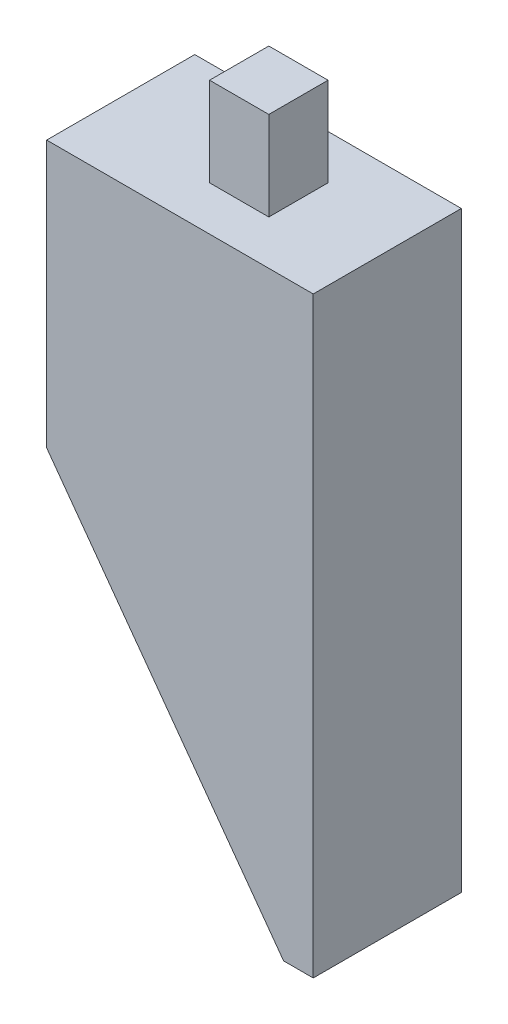
ISO-10303-21;
HEADER;
FILE_DESCRIPTION(('STEP AP214'),'2;1');
FILE_NAME('part.step','',(''),(''),'','','');
FILE_SCHEMA(('AUTOMOTIVE_DESIGN { 1 0 10303 214 1 1 1 1 }'));
ENDSEC;
DATA;
#1=APPLICATION_CONTEXT('core data for automotive mechanical design processes');
#2=APPLICATION_PROTOCOL_DEFINITION('international standard','automotive_design',2000,#1);
#3=PRODUCT_CONTEXT('',#1,'mechanical');
#4=PRODUCT('Part','Part','',(#3));
#5=PRODUCT_RELATED_PRODUCT_CATEGORY('part','',(#4));
#6=PRODUCT_DEFINITION_FORMATION('','',#4);
#7=PRODUCT_DEFINITION_CONTEXT('part definition',#1,'design');
#8=PRODUCT_DEFINITION('design','',#6,#7);
#9=PRODUCT_DEFINITION_SHAPE('','',#8);
#10=(LENGTH_UNIT() NAMED_UNIT(*) SI_UNIT(.MILLI.,.METRE.));
#11=(NAMED_UNIT(*) PLANE_ANGLE_UNIT() SI_UNIT($,.RADIAN.));
#12=(NAMED_UNIT(*) SI_UNIT($,.STERADIAN.) SOLID_ANGLE_UNIT());
#13=UNCERTAINTY_MEASURE_WITH_UNIT(LENGTH_MEASURE(1.E-05),#10,'distance_accuracy_value','');
#14=(GEOMETRIC_REPRESENTATION_CONTEXT(3) GLOBAL_UNCERTAINTY_ASSIGNED_CONTEXT((#13)) GLOBAL_UNIT_ASSIGNED_CONTEXT((#10,
#11,#12)) REPRESENTATION_CONTEXT('',''));
#15=CARTESIAN_POINT('',(0.,0.,0.));
#16=DIRECTION('',(0.,0.,1.));
#17=DIRECTION('',(1.,0.,0.));
#18=AXIS2_PLACEMENT_3D('',#15,#16,#17);
#19=CARTESIAN_POINT('',(90.,200.,50.));
#20=DIRECTION('',(0.,-1.,0.));
#21=DIRECTION('',(0.,0.,-1.));
#22=AXIS2_PLACEMENT_3D('',#19,#20,#21);
#23=PLANE('',#22);
#24=DIRECTION('',(-1.,0.,0.));
#25=VECTOR('',#24,1.);
#26=CARTESIAN_POINT('',(90.,200.,0.));
#27=LINE('',#26,#25);
#28=CARTESIAN_POINT('',(90.,200.,0.));
#29=VERTEX_POINT('',#28);
#30=CARTESIAN_POINT('',(0.,200.,0.));
#31=VERTEX_POINT('',#30);
#32=EDGE_CURVE('E125',#29,#31,#27,.T.);
#33=ORIENTED_EDGE('',*,*,#32,.T.);
#34=DIRECTION('',(0.,0.,-1.));
#35=VECTOR('',#34,1.);
#36=CARTESIAN_POINT('',(0.,200.,50.));
#37=LINE('',#36,#35);
#38=CARTESIAN_POINT('',(0.,200.,50.));
#39=VERTEX_POINT('',#38);
#40=EDGE_CURVE('E11',#39,#31,#37,.T.);
#41=ORIENTED_EDGE('',*,*,#40,.F.);
#42=DIRECTION('',(-1.,0.,0.));
#43=VECTOR('',#42,1.);
#44=CARTESIAN_POINT('',(90.,200.,50.));
#45=LINE('',#44,#43);
#46=CARTESIAN_POINT('',(90.,200.,50.));
#47=VERTEX_POINT('',#46);
#48=EDGE_CURVE('E134',#47,#39,#45,.T.);
#49=ORIENTED_EDGE('',*,*,#48,.F.);
#50=DIRECTION('',(0.,0.,-1.));
#51=VECTOR('',#50,1.);
#52=CARTESIAN_POINT('',(90.,200.,50.));
#53=LINE('',#52,#51);
#54=EDGE_CURVE('E145',#47,#29,#53,.T.);
#55=ORIENTED_EDGE('',*,*,#54,.T.);
#56=EDGE_LOOP('',(#33,#41,#49,#55));
#57=FACE_BOUND('',#56,.T.);
#58=DIRECTION('',(0.,0.,1.));
#59=VECTOR('',#58,1.);
#60=CARTESIAN_POINT('',(40.,200.,15.));
#61=LINE('',#60,#59);
#62=CARTESIAN_POINT('',(40.,200.,15.));
#63=VERTEX_POINT('',#62);
#64=CARTESIAN_POINT('',(40.,200.,35.));
#65=VERTEX_POINT('',#64);
#66=EDGE_CURVE('E124',#63,#65,#61,.T.);
#67=ORIENTED_EDGE('',*,*,#66,.F.);
#68=DIRECTION('',(-1.,0.,0.));
#69=VECTOR('',#68,1.);
#70=CARTESIAN_POINT('',(40.,200.,15.));
#71=LINE('',#70,#69);
#72=CARTESIAN_POINT('',(60.,200.,15.));
#73=VERTEX_POINT('',#72);
#74=EDGE_CURVE('E121',#73,#63,#71,.T.);
#75=ORIENTED_EDGE('',*,*,#74,.F.);
#76=DIRECTION('',(0.,0.,-1.));
#77=VECTOR('',#76,1.);
#78=CARTESIAN_POINT('',(60.,200.,15.));
#79=LINE('',#78,#77);
#80=CARTESIAN_POINT('',(60.,200.,35.));
#81=VERTEX_POINT('',#80);
#82=EDGE_CURVE('E53',#81,#73,#79,.T.);
#83=ORIENTED_EDGE('',*,*,#82,.F.);
#84=DIRECTION('',(1.,0.,0.));
#85=VECTOR('',#84,1.);
#86=CARTESIAN_POINT('',(40.,200.,35.));
#87=LINE('',#86,#85);
#88=EDGE_CURVE('E48',#65,#81,#87,.T.);
#89=ORIENTED_EDGE('',*,*,#88,.F.);
#90=EDGE_LOOP('',(#67,#75,#83,#89));
#91=FACE_BOUND('',#90,.T.);
#92=ADVANCED_FACE('F34',(#57,#91),#23,.F.);
#93=CARTESIAN_POINT('',(0.,200.,50.));
#94=DIRECTION('',(1.,0.,0.));
#95=DIRECTION('',(0.,1.,0.));
#96=AXIS2_PLACEMENT_3D('',#93,#94,#95);
#97=PLANE('',#96);
#98=DIRECTION('',(0.,-1.,0.));
#99=VECTOR('',#98,1.);
#100=CARTESIAN_POINT('',(0.,200.,0.));
#101=LINE('',#100,#99);
#102=CARTESIAN_POINT('',(0.,110.,0.));
#103=VERTEX_POINT('',#102);
#104=EDGE_CURVE('E128',#31,#103,#101,.T.);
#105=ORIENTED_EDGE('',*,*,#104,.T.);
#106=DIRECTION('',(0.,0.,-1.));
#107=VECTOR('',#106,1.);
#108=CARTESIAN_POINT('',(0.,110.,50.));
#109=LINE('',#108,#107);
#110=CARTESIAN_POINT('',(0.,110.,50.));
#111=VERTEX_POINT('',#110);
#112=EDGE_CURVE('E41',#111,#103,#109,.T.);
#113=ORIENTED_EDGE('',*,*,#112,.F.);
#114=DIRECTION('',(0.,-1.,0.));
#115=VECTOR('',#114,1.);
#116=CARTESIAN_POINT('',(0.,200.,50.));
#117=LINE('',#116,#115);
#118=EDGE_CURVE('E137',#39,#111,#117,.T.);
#119=ORIENTED_EDGE('',*,*,#118,.F.);
#120=ORIENTED_EDGE('',*,*,#40,.T.);
#121=EDGE_LOOP('',(#105,#113,#119,#120));
#122=FACE_BOUND('',#121,.T.);
#123=ADVANCED_FACE('F185',(#122),#97,.F.);
#124=CARTESIAN_POINT('',(0.,110.,50.));
#125=DIRECTION('',(0.808736084303189,0.588171697675046,0.));
#126=DIRECTION('',(-0.588171697675046,0.808736084303188,0.));
#127=AXIS2_PLACEMENT_3D('',#124,#125,#126);
#128=PLANE('',#127);
#129=DIRECTION('',(0.588171697675046,-0.808736084303189,0.));
#130=VECTOR('',#129,1.);
#131=CARTESIAN_POINT('',(0.,110.,0.));
#132=LINE('',#131,#130);
#133=CARTESIAN_POINT('',(80.,0.,0.));
#134=VERTEX_POINT('',#133);
#135=EDGE_CURVE('E148',#103,#134,#132,.T.);
#136=ORIENTED_EDGE('',*,*,#135,.T.);
#137=DIRECTION('',(0.,0.,-1.));
#138=VECTOR('',#137,1.);
#139=CARTESIAN_POINT('',(80.,0.,50.));
#140=LINE('',#139,#138);
#141=CARTESIAN_POINT('',(80.,0.,50.));
#142=VERTEX_POINT('',#141);
#143=EDGE_CURVE('E158',#142,#134,#140,.T.);
#144=ORIENTED_EDGE('',*,*,#143,.F.);
#145=DIRECTION('',(0.588171697675046,-0.808736084303189,0.));
#146=VECTOR('',#145,1.);
#147=CARTESIAN_POINT('',(0.,110.,50.));
#148=LINE('',#147,#146);
#149=EDGE_CURVE('E140',#111,#142,#148,.T.);
#150=ORIENTED_EDGE('',*,*,#149,.F.);
#151=ORIENTED_EDGE('',*,*,#112,.T.);
#152=EDGE_LOOP('',(#136,#144,#150,#151));
#153=FACE_BOUND('',#152,.T.);
#154=ADVANCED_FACE('F165',(#153),#128,.F.);
#155=CARTESIAN_POINT('',(80.,0.,50.));
#156=DIRECTION('',(0.,1.,0.));
#157=DIRECTION('',(0.,0.,1.));
#158=AXIS2_PLACEMENT_3D('',#155,#156,#157);
#159=PLANE('',#158);
#160=DIRECTION('',(1.,0.,0.));
#161=VECTOR('',#160,1.);
#162=CARTESIAN_POINT('',(80.,0.,0.));
#163=LINE('',#162,#161);
#164=CARTESIAN_POINT('',(90.,0.,0.));
#165=VERTEX_POINT('',#164);
#166=EDGE_CURVE('E150',#134,#165,#163,.T.);
#167=ORIENTED_EDGE('',*,*,#166,.T.);
#168=DIRECTION('',(0.,0.,-1.));
#169=VECTOR('',#168,1.);
#170=CARTESIAN_POINT('',(90.,0.,50.));
#171=LINE('',#170,#169);
#172=CARTESIAN_POINT('',(90.,0.,50.));
#173=VERTEX_POINT('',#172);
#174=EDGE_CURVE('E155',#173,#165,#171,.T.);
#175=ORIENTED_EDGE('',*,*,#174,.F.);
#176=DIRECTION('',(1.,0.,0.));
#177=VECTOR('',#176,1.);
#178=CARTESIAN_POINT('',(80.,0.,50.));
#179=LINE('',#178,#177);
#180=EDGE_CURVE('E142',#142,#173,#179,.T.);
#181=ORIENTED_EDGE('',*,*,#180,.F.);
#182=ORIENTED_EDGE('',*,*,#143,.T.);
#183=EDGE_LOOP('',(#167,#175,#181,#182));
#184=FACE_BOUND('',#183,.T.);
#185=ADVANCED_FACE('F175',(#184),#159,.F.);
#186=CARTESIAN_POINT('',(90.,0.,50.));
#187=DIRECTION('',(-1.,0.,0.));
#188=DIRECTION('',(0.,-1.,0.));
#189=AXIS2_PLACEMENT_3D('',#186,#187,#188);
#190=PLANE('',#189);
#191=DIRECTION('',(0.,1.,0.));
#192=VECTOR('',#191,1.);
#193=CARTESIAN_POINT('',(90.,0.,0.));
#194=LINE('',#193,#192);
#195=EDGE_CURVE('E138',#165,#29,#194,.T.);
#196=ORIENTED_EDGE('',*,*,#195,.T.);
#197=ORIENTED_EDGE('',*,*,#54,.F.);
#198=DIRECTION('',(0.,1.,0.));
#199=VECTOR('',#198,1.);
#200=CARTESIAN_POINT('',(90.,0.,50.));
#201=LINE('',#200,#199);
#202=EDGE_CURVE('E144',#173,#47,#201,.T.);
#203=ORIENTED_EDGE('',*,*,#202,.F.);
#204=ORIENTED_EDGE('',*,*,#174,.T.);
#205=EDGE_LOOP('',(#196,#197,#203,#204));
#206=FACE_BOUND('',#205,.T.);
#207=ADVANCED_FACE('F179',(#206),#190,.F.);
#208=CARTESIAN_POINT('',(0.,0.,50.));
#209=DIRECTION('',(0.,0.,1.));
#210=DIRECTION('',(1.,0.,0.));
#211=AXIS2_PLACEMENT_3D('',#208,#209,#210);
#212=PLANE('',#211);
#213=ORIENTED_EDGE('',*,*,#48,.T.);
#214=ORIENTED_EDGE('',*,*,#118,.T.);
#215=ORIENTED_EDGE('',*,*,#149,.T.);
#216=ORIENTED_EDGE('',*,*,#180,.T.);
#217=ORIENTED_EDGE('',*,*,#202,.T.);
#218=EDGE_LOOP('',(#213,#214,#215,#216,#217));
#219=FACE_BOUND('',#218,.T.);
#220=ADVANCED_FACE('F183',(#219),#212,.T.);
#221=CARTESIAN_POINT('',(0.,0.,0.));
#222=DIRECTION('',(0.,0.,1.));
#223=DIRECTION('',(1.,0.,0.));
#224=AXIS2_PLACEMENT_3D('',#221,#222,#223);
#225=PLANE('',#224);
#226=ORIENTED_EDGE('',*,*,#32,.F.);
#227=ORIENTED_EDGE('',*,*,#195,.F.);
#228=ORIENTED_EDGE('',*,*,#166,.F.);
#229=ORIENTED_EDGE('',*,*,#135,.F.);
#230=ORIENTED_EDGE('',*,*,#104,.F.);
#231=EDGE_LOOP('',(#226,#227,#228,#229,#230));
#232=FACE_BOUND('',#231,.T.);
#233=ADVANCED_FACE('F171',(#232),#225,.F.);
#234=CARTESIAN_POINT('',(40.,230.,15.));
#235=DIRECTION('',(1.,0.,0.));
#236=DIRECTION('',(0.,0.,-1.));
#237=AXIS2_PLACEMENT_3D('',#234,#235,#236);
#238=PLANE('',#237);
#239=ORIENTED_EDGE('',*,*,#66,.T.);
#240=DIRECTION('',(0.,-1.,0.));
#241=VECTOR('',#240,1.);
#242=CARTESIAN_POINT('',(40.,230.,35.));
#243=LINE('',#242,#241);
#244=CARTESIAN_POINT('',(40.,230.,35.));
#245=VERTEX_POINT('',#244);
#246=EDGE_CURVE('E105',#245,#65,#243,.T.);
#247=ORIENTED_EDGE('',*,*,#246,.F.);
#248=DIRECTION('',(0.,0.,1.));
#249=VECTOR('',#248,1.);
#250=CARTESIAN_POINT('',(40.,230.,15.));
#251=LINE('',#250,#249);
#252=CARTESIAN_POINT('',(40.,230.,15.));
#253=VERTEX_POINT('',#252);
#254=EDGE_CURVE('E112',#253,#245,#251,.T.);
#255=ORIENTED_EDGE('',*,*,#254,.F.);
#256=DIRECTION('',(0.,-1.,0.));
#257=VECTOR('',#256,1.);
#258=CARTESIAN_POINT('',(40.,230.,15.));
#259=LINE('',#258,#257);
#260=EDGE_CURVE('E193',#253,#63,#259,.T.);
#261=ORIENTED_EDGE('',*,*,#260,.T.);
#262=EDGE_LOOP('',(#239,#247,#255,#261));
#263=FACE_BOUND('',#262,.T.);
#264=ADVANCED_FACE('F123',(#263),#238,.F.);
#265=CARTESIAN_POINT('',(40.,230.,35.));
#266=DIRECTION('',(0.,0.,-1.));
#267=DIRECTION('',(-1.,0.,0.));
#268=AXIS2_PLACEMENT_3D('',#265,#266,#267);
#269=PLANE('',#268);
#270=ORIENTED_EDGE('',*,*,#88,.T.);
#271=DIRECTION('',(0.,-1.,0.));
#272=VECTOR('',#271,1.);
#273=CARTESIAN_POINT('',(60.,230.,35.));
#274=LINE('',#273,#272);
#275=CARTESIAN_POINT('',(60.,230.,35.));
#276=VERTEX_POINT('',#275);
#277=EDGE_CURVE('E108',#276,#81,#274,.T.);
#278=ORIENTED_EDGE('',*,*,#277,.F.);
#279=DIRECTION('',(1.,0.,0.));
#280=VECTOR('',#279,1.);
#281=CARTESIAN_POINT('',(40.,230.,35.));
#282=LINE('',#281,#280);
#283=EDGE_CURVE('E101',#245,#276,#282,.T.);
#284=ORIENTED_EDGE('',*,*,#283,.F.);
#285=ORIENTED_EDGE('',*,*,#246,.T.);
#286=EDGE_LOOP('',(#270,#278,#284,#285));
#287=FACE_BOUND('',#286,.T.);
#288=ADVANCED_FACE('F103',(#287),#269,.F.);
#289=CARTESIAN_POINT('',(60.,230.,15.));
#290=DIRECTION('',(-1.,0.,0.));
#291=DIRECTION('',(0.,0.,1.));
#292=AXIS2_PLACEMENT_3D('',#289,#290,#291);
#293=PLANE('',#292);
#294=ORIENTED_EDGE('',*,*,#82,.T.);
#295=DIRECTION('',(0.,-1.,0.));
#296=VECTOR('',#295,1.);
#297=CARTESIAN_POINT('',(60.,230.,15.));
#298=LINE('',#297,#296);
#299=CARTESIAN_POINT('',(60.,230.,15.));
#300=VERTEX_POINT('',#299);
#301=EDGE_CURVE('E130',#300,#73,#298,.T.);
#302=ORIENTED_EDGE('',*,*,#301,.F.);
#303=DIRECTION('',(0.,0.,-1.));
#304=VECTOR('',#303,1.);
#305=CARTESIAN_POINT('',(60.,230.,15.));
#306=LINE('',#305,#304);
#307=EDGE_CURVE('E111',#276,#300,#306,.T.);
#308=ORIENTED_EDGE('',*,*,#307,.F.);
#309=ORIENTED_EDGE('',*,*,#277,.T.);
#310=EDGE_LOOP('',(#294,#302,#308,#309));
#311=FACE_BOUND('',#310,.T.);
#312=ADVANCED_FACE('F202',(#311),#293,.F.);
#313=CARTESIAN_POINT('',(40.,230.,15.));
#314=DIRECTION('',(0.,0.,1.));
#315=DIRECTION('',(1.,0.,0.));
#316=AXIS2_PLACEMENT_3D('',#313,#314,#315);
#317=PLANE('',#316);
#318=ORIENTED_EDGE('',*,*,#74,.T.);
#319=ORIENTED_EDGE('',*,*,#260,.F.);
#320=DIRECTION('',(-1.,0.,0.));
#321=VECTOR('',#320,1.);
#322=CARTESIAN_POINT('',(40.,230.,15.));
#323=LINE('',#322,#321);
#324=EDGE_CURVE('E117',#300,#253,#323,.T.);
#325=ORIENTED_EDGE('',*,*,#324,.F.);
#326=ORIENTED_EDGE('',*,*,#301,.T.);
#327=EDGE_LOOP('',(#318,#319,#325,#326));
#328=FACE_BOUND('',#327,.T.);
#329=ADVANCED_FACE('F192',(#328),#317,.F.);
#330=CARTESIAN_POINT('',(0.,230.,0.));
#331=DIRECTION('',(0.,1.,0.));
#332=DIRECTION('',(0.,0.,1.));
#333=AXIS2_PLACEMENT_3D('',#330,#331,#332);
#334=PLANE('',#333);
#335=ORIENTED_EDGE('',*,*,#254,.T.);
#336=ORIENTED_EDGE('',*,*,#283,.T.);
#337=ORIENTED_EDGE('',*,*,#307,.T.);
#338=ORIENTED_EDGE('',*,*,#324,.T.);
#339=EDGE_LOOP('',(#335,#336,#337,#338));
#340=FACE_BOUND('',#339,.T.);
#341=ADVANCED_FACE('F115',(#340),#334,.T.);
#342=CLOSED_SHELL('',(#92,#123,#154,#185,#207,#220,#233,#264,#288,#312,#329,#341));
#343=MANIFOLD_SOLID_BREP('B2',#342);
#344=ADVANCED_BREP_SHAPE_REPRESENTATION('',(#18,#343),#14);
#345=SHAPE_DEFINITION_REPRESENTATION(#9,#344);
ENDSEC;
END-ISO-10303-21;
